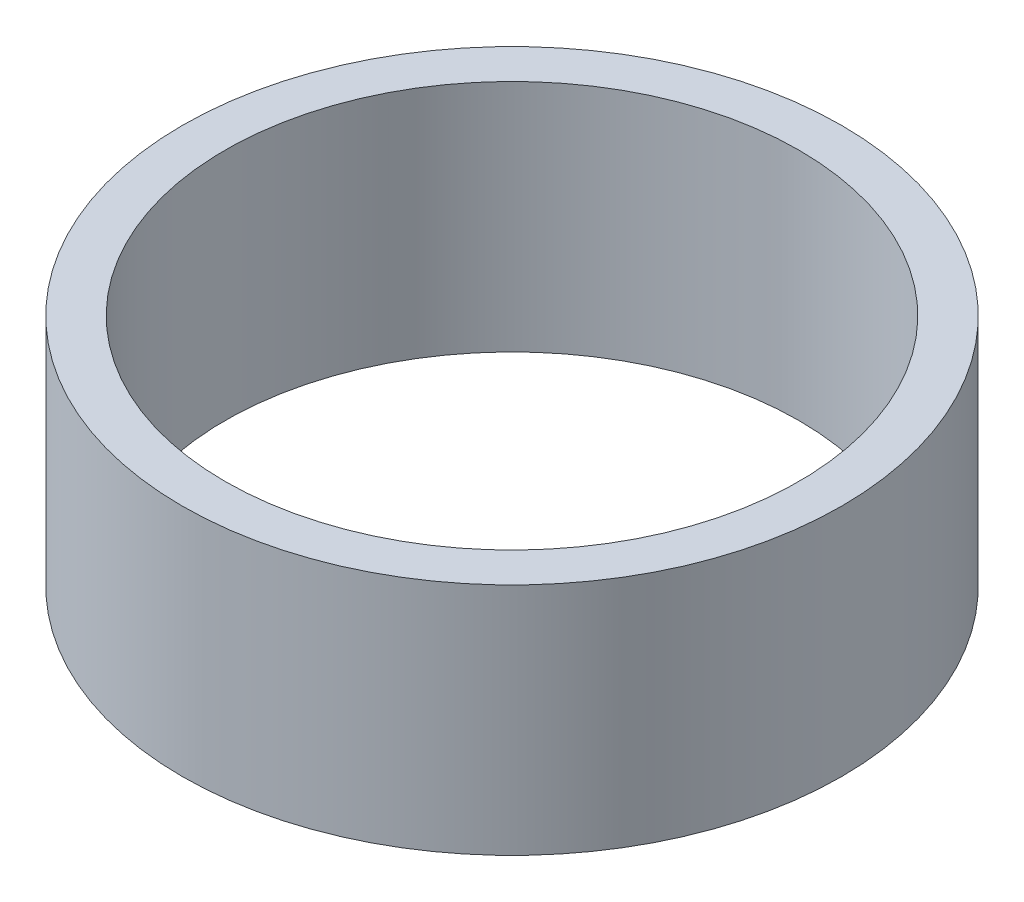
ISO-10303-21;
HEADER;
FILE_DESCRIPTION(('STEP AP214'),'2;1');
FILE_NAME('part.step','',(''),(''),'','','');
FILE_SCHEMA(('AUTOMOTIVE_DESIGN { 1 0 10303 214 1 1 1 1 }'));
ENDSEC;
DATA;
#1=APPLICATION_CONTEXT('core data for automotive mechanical design processes');
#2=APPLICATION_PROTOCOL_DEFINITION('international standard','automotive_design',2000,#1);
#3=PRODUCT_CONTEXT('',#1,'mechanical');
#4=PRODUCT('Part','Part','',(#3));
#5=PRODUCT_RELATED_PRODUCT_CATEGORY('part','',(#4));
#6=PRODUCT_DEFINITION_FORMATION('','',#4);
#7=PRODUCT_DEFINITION_CONTEXT('part definition',#1,'design');
#8=PRODUCT_DEFINITION('design','',#6,#7);
#9=PRODUCT_DEFINITION_SHAPE('','',#8);
#10=(LENGTH_UNIT() NAMED_UNIT(*) SI_UNIT(.MILLI.,.METRE.));
#11=(NAMED_UNIT(*) PLANE_ANGLE_UNIT() SI_UNIT($,.RADIAN.));
#12=(NAMED_UNIT(*) SI_UNIT($,.STERADIAN.) SOLID_ANGLE_UNIT());
#13=UNCERTAINTY_MEASURE_WITH_UNIT(LENGTH_MEASURE(1.E-05),#10,'distance_accuracy_value','');
#14=(GEOMETRIC_REPRESENTATION_CONTEXT(3) GLOBAL_UNCERTAINTY_ASSIGNED_CONTEXT((#13)) GLOBAL_UNIT_ASSIGNED_CONTEXT((#10,
#11,#12)) REPRESENTATION_CONTEXT('',''));
#15=CARTESIAN_POINT('',(0.,0.,0.));
#16=DIRECTION('',(0.,0.,1.));
#17=DIRECTION('',(1.,0.,0.));
#18=AXIS2_PLACEMENT_3D('',#15,#16,#17);
#19=CARTESIAN_POINT('',(0.,0.,0.));
#20=DIRECTION('',(0.,-1.,0.));
#21=DIRECTION('',(0.,0.,-1.));
#22=AXIS2_PLACEMENT_3D('',#19,#20,#21);
#23=CYLINDRICAL_SURFACE('',#22,62.23);
#24=CARTESIAN_POINT('',(0.,0.,0.));
#25=DIRECTION('',(0.,-1.,0.));
#26=DIRECTION('',(0.,0.,-1.));
#27=AXIS2_PLACEMENT_3D('',#24,#25,#26);
#28=CIRCLE('',#27,62.23);
#29=CARTESIAN_POINT('',(0.,0.,-62.23));
#30=VERTEX_POINT('',#29);
#31=EDGE_CURVE('E47',#30,#30,#28,.T.);
#32=ORIENTED_EDGE('',*,*,#31,.T.);
#33=EDGE_LOOP('',(#32));
#34=FACE_BOUND('',#33,.T.);
#35=CARTESIAN_POINT('',(0.,50.8,0.));
#36=DIRECTION('',(0.,-1.,0.));
#37=DIRECTION('',(0.,0.,-1.));
#38=AXIS2_PLACEMENT_3D('',#35,#36,#37);
#39=CIRCLE('',#38,62.23);
#40=CARTESIAN_POINT('',(0.,50.8,-62.23));
#41=VERTEX_POINT('',#40);
#42=EDGE_CURVE('E10',#41,#41,#39,.T.);
#43=ORIENTED_EDGE('',*,*,#42,.F.);
#44=EDGE_LOOP('',(#43));
#45=FACE_BOUND('',#44,.T.);
#46=ADVANCED_FACE('F33',(#34,#45),#23,.F.);
#47=CARTESIAN_POINT('',(62.23,50.8,0.));
#48=DIRECTION('',(0.,1.,0.));
#49=DIRECTION('',(0.,0.,1.));
#50=AXIS2_PLACEMENT_3D('',#47,#48,#49);
#51=PLANE('',#50);
#52=ORIENTED_EDGE('',*,*,#42,.T.);
#53=EDGE_LOOP('',(#52));
#54=FACE_BOUND('',#53,.T.);
#55=CARTESIAN_POINT('',(0.,50.8,0.));
#56=DIRECTION('',(0.,-1.,0.));
#57=DIRECTION('',(0.,0.,-1.));
#58=AXIS2_PLACEMENT_3D('',#55,#56,#57);
#59=CIRCLE('',#58,71.501);
#60=CARTESIAN_POINT('',(0.,50.8,-71.501));
#61=VERTEX_POINT('',#60);
#62=EDGE_CURVE('E39',#61,#61,#59,.T.);
#63=ORIENTED_EDGE('',*,*,#62,.F.);
#64=EDGE_LOOP('',(#63));
#65=FACE_BOUND('',#64,.T.);
#66=ADVANCED_FACE('F63',(#54,#65),#51,.T.);
#67=CARTESIAN_POINT('',(0.,0.,0.));
#68=DIRECTION('',(0.,-1.,0.));
#69=DIRECTION('',(0.,0.,-1.));
#70=AXIS2_PLACEMENT_3D('',#67,#68,#69);
#71=CYLINDRICAL_SURFACE('',#70,71.501);
#72=ORIENTED_EDGE('',*,*,#62,.T.);
#73=EDGE_LOOP('',(#72));
#74=FACE_BOUND('',#73,.T.);
#75=CARTESIAN_POINT('',(0.,0.,0.));
#76=DIRECTION('',(0.,-1.,0.));
#77=DIRECTION('',(0.,0.,-1.));
#78=AXIS2_PLACEMENT_3D('',#75,#76,#77);
#79=CIRCLE('',#78,71.501);
#80=CARTESIAN_POINT('',(0.,0.,-71.501));
#81=VERTEX_POINT('',#80);
#82=EDGE_CURVE('E43',#81,#81,#79,.T.);
#83=ORIENTED_EDGE('',*,*,#82,.F.);
#84=EDGE_LOOP('',(#83));
#85=FACE_BOUND('',#84,.T.);
#86=ADVANCED_FACE('F57',(#74,#85),#71,.T.);
#87=CARTESIAN_POINT('',(62.23,0.,0.));
#88=DIRECTION('',(0.,-1.,0.));
#89=DIRECTION('',(0.,0.,-1.));
#90=AXIS2_PLACEMENT_3D('',#87,#88,#89);
#91=PLANE('',#90);
#92=ORIENTED_EDGE('',*,*,#82,.T.);
#93=EDGE_LOOP('',(#92));
#94=FACE_BOUND('',#93,.T.);
#95=ORIENTED_EDGE('',*,*,#31,.F.);
#96=EDGE_LOOP('',(#95));
#97=FACE_BOUND('',#96,.T.);
#98=ADVANCED_FACE('F55',(#94,#97),#91,.T.);
#99=CLOSED_SHELL('',(#46,#66,#86,#98));
#100=MANIFOLD_SOLID_BREP('B2',#99);
#101=ADVANCED_BREP_SHAPE_REPRESENTATION('',(#18,#100),#14);
#102=SHAPE_DEFINITION_REPRESENTATION(#9,#101);
ENDSEC;
END-ISO-10303-21;
